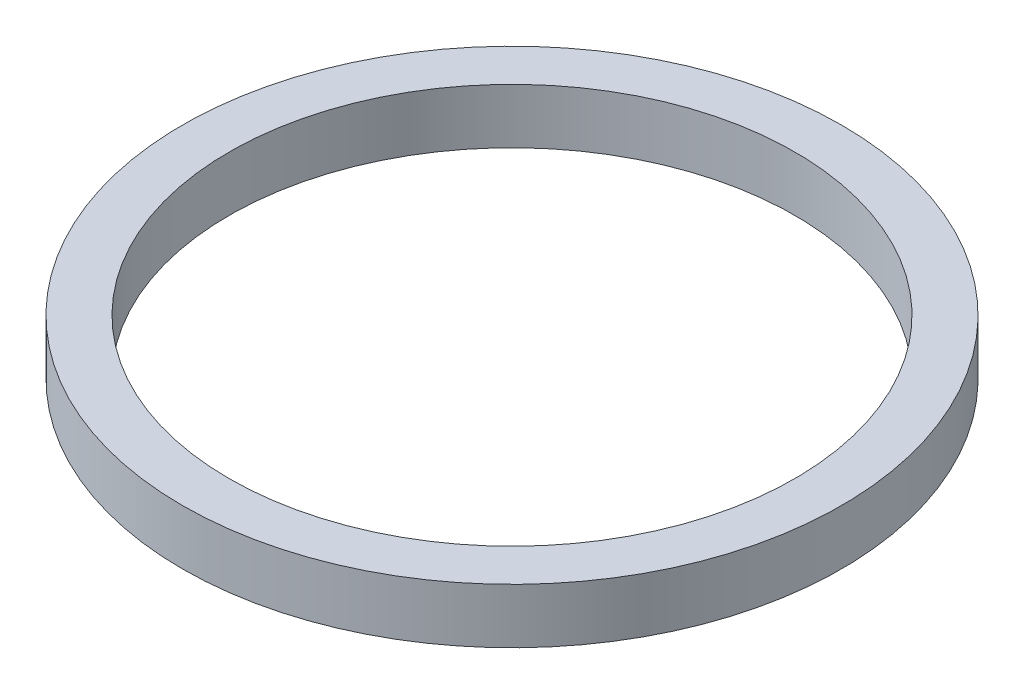
ISO-10303-21;
HEADER;
FILE_DESCRIPTION(('STEP AP214'),'2;1');
FILE_NAME('part.step','',(''),(''),'','','');
FILE_SCHEMA(('AUTOMOTIVE_DESIGN { 1 0 10303 214 1 1 1 1 }'));
ENDSEC;
DATA;
#1=APPLICATION_CONTEXT('core data for automotive mechanical design processes');
#2=APPLICATION_PROTOCOL_DEFINITION('international standard','automotive_design',2000,#1);
#3=PRODUCT_CONTEXT('',#1,'mechanical');
#4=PRODUCT('Part','Part','',(#3));
#5=PRODUCT_RELATED_PRODUCT_CATEGORY('part','',(#4));
#6=PRODUCT_DEFINITION_FORMATION('','',#4);
#7=PRODUCT_DEFINITION_CONTEXT('part definition',#1,'design');
#8=PRODUCT_DEFINITION('design','',#6,#7);
#9=PRODUCT_DEFINITION_SHAPE('','',#8);
#10=(LENGTH_UNIT() NAMED_UNIT(*) SI_UNIT(.MILLI.,.METRE.));
#11=(NAMED_UNIT(*) PLANE_ANGLE_UNIT() SI_UNIT($,.RADIAN.));
#12=(NAMED_UNIT(*) SI_UNIT($,.STERADIAN.) SOLID_ANGLE_UNIT());
#13=UNCERTAINTY_MEASURE_WITH_UNIT(LENGTH_MEASURE(1.E-05),#10,'distance_accuracy_value','');
#14=(GEOMETRIC_REPRESENTATION_CONTEXT(3) GLOBAL_UNCERTAINTY_ASSIGNED_CONTEXT((#13)) GLOBAL_UNIT_ASSIGNED_CONTEXT((#10,
#11,#12)) REPRESENTATION_CONTEXT('',''));
#15=CARTESIAN_POINT('',(0.,0.,0.));
#16=DIRECTION('',(0.,0.,1.));
#17=DIRECTION('',(1.,0.,0.));
#18=AXIS2_PLACEMENT_3D('',#15,#16,#17);
#19=CARTESIAN_POINT('',(0.,2.54,0.));
#20=DIRECTION('',(0.,1.,0.));
#21=DIRECTION('',(0.,0.,1.));
#22=AXIS2_PLACEMENT_3D('',#19,#20,#21);
#23=PLANE('',#22);
#24=CARTESIAN_POINT('',(0.,2.54,0.));
#25=DIRECTION('',(0.,1.,0.));
#26=DIRECTION('',(0.,0.,1.));
#27=AXIS2_PLACEMENT_3D('',#24,#25,#26);
#28=CIRCLE('',#27,15.24);
#29=CARTESIAN_POINT('',(0.,2.54,15.24));
#30=VERTEX_POINT('',#29);
#31=EDGE_CURVE('E10',#30,#30,#28,.T.);
#32=ORIENTED_EDGE('',*,*,#31,.T.);
#33=EDGE_LOOP('',(#32));
#34=FACE_BOUND('',#33,.T.);
#35=CARTESIAN_POINT('',(0.,2.54,0.));
#36=DIRECTION('',(0.,1.,0.));
#37=DIRECTION('',(0.,0.,1.));
#38=AXIS2_PLACEMENT_3D('',#35,#36,#37);
#39=CIRCLE('',#38,13.081);
#40=CARTESIAN_POINT('',(0.,2.54,13.081));
#41=VERTEX_POINT('',#40);
#42=EDGE_CURVE('E42',#41,#41,#39,.T.);
#43=ORIENTED_EDGE('',*,*,#42,.F.);
#44=EDGE_LOOP('',(#43));
#45=FACE_BOUND('',#44,.T.);
#46=ADVANCED_FACE('F31',(#34,#45),#23,.T.);
#47=CARTESIAN_POINT('',(0.,0.,0.));
#48=DIRECTION('',(0.,1.,0.));
#49=DIRECTION('',(0.,0.,1.));
#50=AXIS2_PLACEMENT_3D('',#47,#48,#49);
#51=PLANE('',#50);
#52=CARTESIAN_POINT('',(0.,0.,0.));
#53=DIRECTION('',(0.,1.,0.));
#54=DIRECTION('',(0.,0.,1.));
#55=AXIS2_PLACEMENT_3D('',#52,#53,#54);
#56=CIRCLE('',#55,15.24);
#57=CARTESIAN_POINT('',(0.,0.,15.24));
#58=VERTEX_POINT('',#57);
#59=EDGE_CURVE('E35',#58,#58,#56,.T.);
#60=ORIENTED_EDGE('',*,*,#59,.F.);
#61=EDGE_LOOP('',(#60));
#62=FACE_BOUND('',#61,.T.);
#63=CARTESIAN_POINT('',(0.,0.,0.));
#64=DIRECTION('',(0.,1.,0.));
#65=DIRECTION('',(0.,0.,1.));
#66=AXIS2_PLACEMENT_3D('',#63,#64,#65);
#67=CIRCLE('',#66,13.081);
#68=CARTESIAN_POINT('',(0.,0.,13.081));
#69=VERTEX_POINT('',#68);
#70=EDGE_CURVE('E44',#69,#69,#67,.T.);
#71=ORIENTED_EDGE('',*,*,#70,.T.);
#72=EDGE_LOOP('',(#71));
#73=FACE_BOUND('',#72,.T.);
#74=ADVANCED_FACE('F54',(#62,#73),#51,.F.);
#75=CARTESIAN_POINT('',(0.,2.54,0.));
#76=DIRECTION('',(0.,-1.,0.));
#77=DIRECTION('',(0.,0.,-1.));
#78=AXIS2_PLACEMENT_3D('',#75,#76,#77);
#79=CYLINDRICAL_SURFACE('',#78,15.24);
#80=ORIENTED_EDGE('',*,*,#31,.F.);
#81=EDGE_LOOP('',(#80));
#82=FACE_BOUND('',#81,.T.);
#83=ORIENTED_EDGE('',*,*,#59,.T.);
#84=EDGE_LOOP('',(#83));
#85=FACE_BOUND('',#84,.T.);
#86=ADVANCED_FACE('F33',(#82,#85),#79,.T.);
#87=CARTESIAN_POINT('',(0.,2.54,0.));
#88=DIRECTION('',(0.,-1.,0.));
#89=DIRECTION('',(0.,0.,-1.));
#90=AXIS2_PLACEMENT_3D('',#87,#88,#89);
#91=CYLINDRICAL_SURFACE('',#90,13.081);
#92=ORIENTED_EDGE('',*,*,#42,.T.);
#93=EDGE_LOOP('',(#92));
#94=FACE_BOUND('',#93,.T.);
#95=ORIENTED_EDGE('',*,*,#70,.F.);
#96=EDGE_LOOP('',(#95));
#97=FACE_BOUND('',#96,.T.);
#98=ADVANCED_FACE('F50',(#94,#97),#91,.F.);
#99=CLOSED_SHELL('',(#46,#74,#86,#98));
#100=MANIFOLD_SOLID_BREP('B2',#99);
#101=ADVANCED_BREP_SHAPE_REPRESENTATION('',(#18,#100),#14);
#102=SHAPE_DEFINITION_REPRESENTATION(#9,#101);
ENDSEC;
END-ISO-10303-21;
